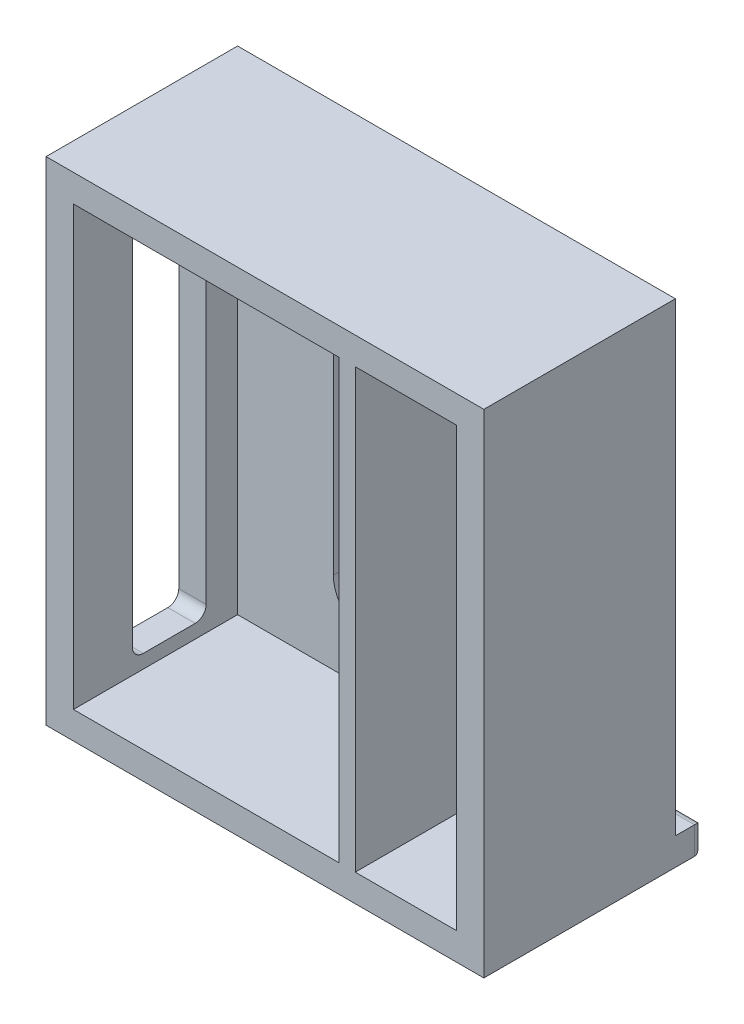
ISO-10303-21;
HEADER;
FILE_DESCRIPTION(('STEP AP214'),'2;1');
FILE_NAME('part.step','',(''),(''),'','','');
FILE_SCHEMA(('AUTOMOTIVE_DESIGN { 1 0 10303 214 1 1 1 1 }'));
ENDSEC;
DATA;
#1=APPLICATION_CONTEXT('core data for automotive mechanical design processes');
#2=APPLICATION_PROTOCOL_DEFINITION('international standard','automotive_design',2000,#1);
#3=PRODUCT_CONTEXT('',#1,'mechanical');
#4=PRODUCT('Part','Part','',(#3));
#5=PRODUCT_RELATED_PRODUCT_CATEGORY('part','',(#4));
#6=PRODUCT_DEFINITION_FORMATION('','',#4);
#7=PRODUCT_DEFINITION_CONTEXT('part definition',#1,'design');
#8=PRODUCT_DEFINITION('design','',#6,#7);
#9=PRODUCT_DEFINITION_SHAPE('','',#8);
#10=(LENGTH_UNIT() NAMED_UNIT(*) SI_UNIT(.MILLI.,.METRE.));
#11=(NAMED_UNIT(*) PLANE_ANGLE_UNIT() SI_UNIT($,.RADIAN.));
#12=(NAMED_UNIT(*) SI_UNIT($,.STERADIAN.) SOLID_ANGLE_UNIT());
#13=UNCERTAINTY_MEASURE_WITH_UNIT(LENGTH_MEASURE(1.E-05),#10,'distance_accuracy_value','');
#14=(GEOMETRIC_REPRESENTATION_CONTEXT(3) GLOBAL_UNCERTAINTY_ASSIGNED_CONTEXT((#13)) GLOBAL_UNIT_ASSIGNED_CONTEXT((#10,
#11,#12)) REPRESENTATION_CONTEXT('',''));
#15=CARTESIAN_POINT('',(0.,0.,0.));
#16=DIRECTION('',(0.,0.,1.));
#17=DIRECTION('',(1.,0.,0.));
#18=AXIS2_PLACEMENT_3D('',#15,#16,#17);
#19=CARTESIAN_POINT('',(-80.,180.,-35.));
#20=DIRECTION('',(0.,0.,1.));
#21=DIRECTION('',(1.,0.,0.));
#22=AXIS2_PLACEMENT_3D('',#19,#20,#21);
#23=PLANE('',#22);
#24=DIRECTION('',(0.,1.,0.));
#25=VECTOR('',#24,1.);
#26=CARTESIAN_POINT('',(-8.00000000000008,180.,-35.));
#27=LINE('',#26,#25);
#28=CARTESIAN_POINT('',(-8.00000000000007,40.,-35.));
#29=VERTEX_POINT('',#28);
#30=CARTESIAN_POINT('',(-8.00000000000007,140.,-35.));
#31=VERTEX_POINT('',#30);
#32=EDGE_CURVE('E466',#29,#31,#27,.T.);
#33=ORIENTED_EDGE('',*,*,#32,.T.);
#34=CARTESIAN_POINT('',(-21.5000000000001,140.,-35.));
#35=DIRECTION('',(0.,0.,1.));
#36=DIRECTION('',(1.,0.,0.));
#37=AXIS2_PLACEMENT_3D('',#34,#35,#36);
#38=CIRCLE('',#37,13.5);
#39=CARTESIAN_POINT('',(-35.0000000000001,140.,-35.));
#40=VERTEX_POINT('',#39);
#41=EDGE_CURVE('E469',#31,#40,#38,.T.);
#42=ORIENTED_EDGE('',*,*,#41,.T.);
#43=DIRECTION('',(0.,-1.,0.));
#44=VECTOR('',#43,1.);
#45=CARTESIAN_POINT('',(-35.0000000000001,180.,-35.));
#46=LINE('',#45,#44);
#47=CARTESIAN_POINT('',(-35.0000000000001,40.,-35.));
#48=VERTEX_POINT('',#47);
#49=EDGE_CURVE('E460',#40,#48,#46,.T.);
#50=ORIENTED_EDGE('',*,*,#49,.T.);
#51=CARTESIAN_POINT('',(-21.5000000000001,40.,-35.));
#52=DIRECTION('',(0.,0.,1.));
#53=DIRECTION('',(1.,0.,0.));
#54=AXIS2_PLACEMENT_3D('',#51,#52,#53);
#55=CIRCLE('',#54,13.5);
#56=EDGE_CURVE('E463',#48,#29,#55,.T.);
#57=ORIENTED_EDGE('',*,*,#56,.T.);
#58=EDGE_LOOP('',(#33,#42,#50,#57));
#59=FACE_BOUND('',#58,.T.);
#60=DIRECTION('',(0.,1.,0.));
#61=VECTOR('',#60,1.);
#62=CARTESIAN_POINT('',(58.9999999999999,180.,-35.));
#63=LINE('',#62,#61);
#64=CARTESIAN_POINT('',(58.9999999999999,42.5,-35.));
#65=VERTEX_POINT('',#64);
#66=CARTESIAN_POINT('',(58.9999999999999,137.5,-35.));
#67=VERTEX_POINT('',#66);
#68=EDGE_CURVE('E478',#65,#67,#63,.T.);
#69=ORIENTED_EDGE('',*,*,#68,.T.);
#70=CARTESIAN_POINT('',(51.4999999999999,137.5,-35.));
#71=DIRECTION('',(0.,0.,1.));
#72=DIRECTION('',(1.,0.,0.));
#73=AXIS2_PLACEMENT_3D('',#70,#71,#72);
#74=CIRCLE('',#73,7.5);
#75=CARTESIAN_POINT('',(43.9999999999999,137.5,-35.));
#76=VERTEX_POINT('',#75);
#77=EDGE_CURVE('E481',#67,#76,#74,.T.);
#78=ORIENTED_EDGE('',*,*,#77,.T.);
#79=DIRECTION('',(0.,-1.,0.));
#80=VECTOR('',#79,1.);
#81=CARTESIAN_POINT('',(43.9999999999999,180.,-35.));
#82=LINE('',#81,#80);
#83=CARTESIAN_POINT('',(44.,42.5,-35.));
#84=VERTEX_POINT('',#83);
#85=EDGE_CURVE('E472',#76,#84,#82,.T.);
#86=ORIENTED_EDGE('',*,*,#85,.T.);
#87=CARTESIAN_POINT('',(51.4999999999999,42.5,-35.));
#88=DIRECTION('',(0.,0.,1.));
#89=DIRECTION('',(1.,0.,0.));
#90=AXIS2_PLACEMENT_3D('',#87,#88,#89);
#91=CIRCLE('',#90,7.5);
#92=EDGE_CURVE('E475',#84,#65,#91,.T.);
#93=ORIENTED_EDGE('',*,*,#92,.T.);
#94=EDGE_LOOP('',(#69,#78,#86,#93));
#95=FACE_BOUND('',#94,.T.);
#96=DIRECTION('',(1.,0.,0.));
#97=VECTOR('',#96,1.);
#98=CARTESIAN_POINT('',(79.9999999999999,10.,-35.));
#99=LINE('',#98,#97);
#100=CARTESIAN_POINT('',(-80.,10.0000000000001,-35.));
#101=VERTEX_POINT('',#100);
#102=CARTESIAN_POINT('',(79.9999999999999,10.,-35.));
#103=VERTEX_POINT('',#102);
#104=EDGE_CURVE('E261',#101,#103,#99,.T.);
#105=ORIENTED_EDGE('',*,*,#104,.F.);
#106=DIRECTION('',(0.,-1.,0.));
#107=VECTOR('',#106,1.);
#108=CARTESIAN_POINT('',(-80.,180.,-35.));
#109=LINE('',#108,#107);
#110=CARTESIAN_POINT('',(-80.,180.,-35.));
#111=VERTEX_POINT('',#110);
#112=EDGE_CURVE('E270',#111,#101,#109,.T.);
#113=ORIENTED_EDGE('',*,*,#112,.F.);
#114=DIRECTION('',(-1.,0.,0.));
#115=VECTOR('',#114,1.);
#116=CARTESIAN_POINT('',(-80.,180.,-35.));
#117=LINE('',#116,#115);
#118=CARTESIAN_POINT('',(80.,180.,-35.));
#119=VERTEX_POINT('',#118);
#120=EDGE_CURVE('E267',#119,#111,#117,.T.);
#121=ORIENTED_EDGE('',*,*,#120,.F.);
#122=DIRECTION('',(0.,-1.,0.));
#123=VECTOR('',#122,1.);
#124=CARTESIAN_POINT('',(80.,180.,-35.));
#125=LINE('',#124,#123);
#126=EDGE_CURVE('E254',#119,#103,#125,.T.);
#127=ORIENTED_EDGE('',*,*,#126,.T.);
#128=EDGE_LOOP('',(#105,#113,#121,#127));
#129=FACE_BOUND('',#128,.T.);
#130=ADVANCED_FACE('F39',(#59,#95,#129),#23,.F.);
#131=CARTESIAN_POINT('',(-80.,180.,-25.));
#132=DIRECTION('',(0.,0.,1.));
#133=DIRECTION('',(1.,0.,0.));
#134=AXIS2_PLACEMENT_3D('',#131,#132,#133);
#135=PLANE('',#134);
#136=CARTESIAN_POINT('',(51.4999999999999,137.5,-25.));
#137=DIRECTION('',(0.,0.,1.));
#138=DIRECTION('',(1.,0.,0.));
#139=AXIS2_PLACEMENT_3D('',#136,#137,#138);
#140=CIRCLE('',#139,7.5);
#141=CARTESIAN_POINT('',(58.9999999999999,137.5,-25.));
#142=VERTEX_POINT('',#141);
#143=CARTESIAN_POINT('',(43.9999999999999,137.5,-25.));
#144=VERTEX_POINT('',#143);
#145=EDGE_CURVE('E342',#142,#144,#140,.T.);
#146=ORIENTED_EDGE('',*,*,#145,.F.);
#147=DIRECTION('',(0.,1.,0.));
#148=VECTOR('',#147,1.);
#149=CARTESIAN_POINT('',(58.9999999999999,137.5,-25.));
#150=LINE('',#149,#148);
#151=CARTESIAN_POINT('',(58.9999999999999,42.5,-25.));
#152=VERTEX_POINT('',#151);
#153=EDGE_CURVE('E350',#152,#142,#150,.T.);
#154=ORIENTED_EDGE('',*,*,#153,.F.);
#155=CARTESIAN_POINT('',(51.4999999999999,42.5,-25.));
#156=DIRECTION('',(0.,0.,1.));
#157=DIRECTION('',(1.,0.,0.));
#158=AXIS2_PLACEMENT_3D('',#155,#156,#157);
#159=CIRCLE('',#158,7.5);
#160=CARTESIAN_POINT('',(43.9999999999999,42.5,-25.));
#161=VERTEX_POINT('',#160);
#162=EDGE_CURVE('E348',#161,#152,#159,.T.);
#163=ORIENTED_EDGE('',*,*,#162,.F.);
#164=DIRECTION('',(0.,-1.,0.));
#165=VECTOR('',#164,1.);
#166=CARTESIAN_POINT('',(43.9999999999999,137.5,-25.));
#167=LINE('',#166,#165);
#168=EDGE_CURVE('E345',#144,#161,#167,.T.);
#169=ORIENTED_EDGE('',*,*,#168,.F.);
#170=EDGE_LOOP('',(#146,#154,#163,#169));
#171=FACE_BOUND('',#170,.T.);
#172=DIRECTION('',(-1.,0.,0.));
#173=VECTOR('',#172,1.);
#174=CARTESIAN_POINT('',(-80.,170.,-25.));
#175=LINE('',#174,#173);
#176=CARTESIAN_POINT('',(70.,170.,-25.));
#177=VERTEX_POINT('',#176);
#178=CARTESIAN_POINT('',(33.,170.,-25.));
#179=VERTEX_POINT('',#178);
#180=EDGE_CURVE('E418',#177,#179,#175,.T.);
#181=ORIENTED_EDGE('',*,*,#180,.T.);
#182=DIRECTION('',(0.,-1.,0.));
#183=VECTOR('',#182,1.);
#184=CARTESIAN_POINT('',(33.,180.,-25.));
#185=LINE('',#184,#183);
#186=CARTESIAN_POINT('',(33.,10.,-25.));
#187=VERTEX_POINT('',#186);
#188=EDGE_CURVE('E392',#179,#187,#185,.T.);
#189=ORIENTED_EDGE('',*,*,#188,.T.);
#190=DIRECTION('',(-1.,0.,0.));
#191=VECTOR('',#190,1.);
#192=CARTESIAN_POINT('',(-80.,10.,-25.));
#193=LINE('',#192,#191);
#194=CARTESIAN_POINT('',(70.,10.,-25.));
#195=VERTEX_POINT('',#194);
#196=EDGE_CURVE('E411',#195,#187,#193,.T.);
#197=ORIENTED_EDGE('',*,*,#196,.F.);
#198=DIRECTION('',(0.,-1.,0.));
#199=VECTOR('',#198,1.);
#200=CARTESIAN_POINT('',(70.,180.,-25.));
#201=LINE('',#200,#199);
#202=EDGE_CURVE('E401',#177,#195,#201,.T.);
#203=ORIENTED_EDGE('',*,*,#202,.F.);
#204=EDGE_LOOP('',(#181,#189,#197,#203));
#205=FACE_BOUND('',#204,.T.);
#206=ADVANCED_FACE('F544',(#171,#205),#135,.T.);
#207=CARTESIAN_POINT('',(0.,170.,0.));
#208=DIRECTION('',(0.,1.,0.));
#209=DIRECTION('',(0.,0.,1.));
#210=AXIS2_PLACEMENT_3D('',#207,#208,#209);
#211=PLANE('',#210);
#212=DIRECTION('',(0.,0.,-1.));
#213=VECTOR('',#212,1.);
#214=CARTESIAN_POINT('',(33.,170.,0.));
#215=LINE('',#214,#213);
#216=CARTESIAN_POINT('',(33.,170.,35.));
#217=VERTEX_POINT('',#216);
#218=EDGE_CURVE('E376',#217,#179,#215,.T.);
#219=ORIENTED_EDGE('',*,*,#218,.T.);
#220=ORIENTED_EDGE('',*,*,#180,.F.);
#221=DIRECTION('',(0.,0.,-1.));
#222=VECTOR('',#221,1.);
#223=CARTESIAN_POINT('',(70.,170.,-35.));
#224=LINE('',#223,#222);
#225=CARTESIAN_POINT('',(70.,170.,35.));
#226=VERTEX_POINT('',#225);
#227=EDGE_CURVE('E406',#226,#177,#224,.T.);
#228=ORIENTED_EDGE('',*,*,#227,.F.);
#229=DIRECTION('',(1.,0.,0.));
#230=VECTOR('',#229,1.);
#231=CARTESIAN_POINT('',(-80.,170.,35.));
#232=LINE('',#231,#230);
#233=EDGE_CURVE('E426',#217,#226,#232,.T.);
#234=ORIENTED_EDGE('',*,*,#233,.F.);
#235=EDGE_LOOP('',(#219,#220,#228,#234));
#236=FACE_BOUND('',#235,.T.);
#237=ADVANCED_FACE('F536',(#236),#211,.F.);
#238=CARTESIAN_POINT('',(0.,10.,0.));
#239=DIRECTION('',(0.,1.,0.));
#240=DIRECTION('',(0.,0.,1.));
#241=AXIS2_PLACEMENT_3D('',#238,#239,#240);
#242=PLANE('',#241);
#243=ORIENTED_EDGE('',*,*,#196,.T.);
#244=DIRECTION('',(0.,0.,1.));
#245=VECTOR('',#244,1.);
#246=CARTESIAN_POINT('',(33.,10.,0.));
#247=LINE('',#246,#245);
#248=CARTESIAN_POINT('',(33.,10.,35.));
#249=VERTEX_POINT('',#248);
#250=EDGE_CURVE('E269',#187,#249,#247,.T.);
#251=ORIENTED_EDGE('',*,*,#250,.T.);
#252=DIRECTION('',(1.,0.,0.));
#253=VECTOR('',#252,1.);
#254=CARTESIAN_POINT('',(-80.,10.,35.));
#255=LINE('',#254,#253);
#256=CARTESIAN_POINT('',(70.,10.,35.));
#257=VERTEX_POINT('',#256);
#258=EDGE_CURVE('E423',#249,#257,#255,.T.);
#259=ORIENTED_EDGE('',*,*,#258,.T.);
#260=DIRECTION('',(0.,0.,-1.));
#261=VECTOR('',#260,1.);
#262=CARTESIAN_POINT('',(70.,10.,-35.));
#263=LINE('',#262,#261);
#264=EDGE_CURVE('E397',#257,#195,#263,.T.);
#265=ORIENTED_EDGE('',*,*,#264,.T.);
#266=EDGE_LOOP('',(#243,#251,#259,#265));
#267=FACE_BOUND('',#266,.T.);
#268=ADVANCED_FACE('F528',(#267),#242,.T.);
#269=CARTESIAN_POINT('',(-80.,180.,35.));
#270=DIRECTION('',(0.,0.,-1.));
#271=DIRECTION('',(-1.,0.,0.));
#272=AXIS2_PLACEMENT_3D('',#269,#270,#271);
#273=PLANE('',#272);
#274=DIRECTION('',(0.,-1.,0.));
#275=VECTOR('',#274,1.);
#276=CARTESIAN_POINT('',(27.,240.256672281001,35.));
#277=LINE('',#276,#275);
#278=CARTESIAN_POINT('',(27.,170.,35.));
#279=VERTEX_POINT('',#278);
#280=CARTESIAN_POINT('',(27.,10.0000000000001,35.));
#281=VERTEX_POINT('',#280);
#282=EDGE_CURVE('E385',#279,#281,#277,.T.);
#283=ORIENTED_EDGE('',*,*,#282,.T.);
#284=CARTESIAN_POINT('',(-70.,10.,35.));
#285=VERTEX_POINT('',#284);
#286=EDGE_CURVE('E410',#285,#281,#255,.T.);
#287=ORIENTED_EDGE('',*,*,#286,.F.);
#288=DIRECTION('',(0.,-1.,0.));
#289=VECTOR('',#288,1.);
#290=CARTESIAN_POINT('',(-70.,180.,35.));
#291=LINE('',#290,#289);
#292=CARTESIAN_POINT('',(-70.,170.,35.));
#293=VERTEX_POINT('',#292);
#294=EDGE_CURVE('E417',#293,#285,#291,.T.);
#295=ORIENTED_EDGE('',*,*,#294,.F.);
#296=EDGE_CURVE('E430',#293,#279,#232,.T.);
#297=ORIENTED_EDGE('',*,*,#296,.T.);
#298=EDGE_LOOP('',(#283,#287,#295,#297));
#299=FACE_BOUND('',#298,.T.);
#300=ORIENTED_EDGE('',*,*,#258,.F.);
#301=DIRECTION('',(0.,-1.,0.));
#302=VECTOR('',#301,1.);
#303=CARTESIAN_POINT('',(33.,240.256672281001,35.));
#304=LINE('',#303,#302);
#305=EDGE_CURVE('E388',#217,#249,#304,.T.);
#306=ORIENTED_EDGE('',*,*,#305,.F.);
#307=ORIENTED_EDGE('',*,*,#233,.T.);
#308=DIRECTION('',(0.,-1.,0.));
#309=VECTOR('',#308,1.);
#310=CARTESIAN_POINT('',(70.,180.,35.));
#311=LINE('',#310,#309);
#312=EDGE_CURVE('E427',#226,#257,#311,.T.);
#313=ORIENTED_EDGE('',*,*,#312,.T.);
#314=EDGE_LOOP('',(#300,#306,#307,#313));
#315=FACE_BOUND('',#314,.T.);
#316=DIRECTION('',(1.,0.,0.));
#317=VECTOR('',#316,1.);
#318=CARTESIAN_POINT('',(-80.,0.,35.));
#319=LINE('',#318,#317);
#320=CARTESIAN_POINT('',(-80.,0.,35.));
#321=VERTEX_POINT('',#320);
#322=CARTESIAN_POINT('',(80.,0.,35.));
#323=VERTEX_POINT('',#322);
#324=EDGE_CURVE('E439',#321,#323,#319,.T.);
#325=ORIENTED_EDGE('',*,*,#324,.T.);
#326=DIRECTION('',(0.,-1.,0.));
#327=VECTOR('',#326,1.);
#328=CARTESIAN_POINT('',(80.,180.,35.));
#329=LINE('',#328,#327);
#330=CARTESIAN_POINT('',(80.,180.,35.));
#331=VERTEX_POINT('',#330);
#332=EDGE_CURVE('E445',#331,#323,#329,.T.);
#333=ORIENTED_EDGE('',*,*,#332,.F.);
#334=DIRECTION('',(1.,0.,0.));
#335=VECTOR('',#334,1.);
#336=CARTESIAN_POINT('',(-80.,180.,35.));
#337=LINE('',#336,#335);
#338=CARTESIAN_POINT('',(-80.,180.,35.));
#339=VERTEX_POINT('',#338);
#340=EDGE_CURVE('E443',#339,#331,#337,.T.);
#341=ORIENTED_EDGE('',*,*,#340,.F.);
#342=DIRECTION('',(0.,-1.,0.));
#343=VECTOR('',#342,1.);
#344=CARTESIAN_POINT('',(-80.,180.,35.));
#345=LINE('',#344,#343);
#346=EDGE_CURVE('E452',#339,#321,#345,.T.);
#347=ORIENTED_EDGE('',*,*,#346,.T.);
#348=EDGE_LOOP('',(#325,#333,#341,#347));
#349=FACE_BOUND('',#348,.T.);
#350=ADVANCED_FACE('F526',(#299,#315,#349),#273,.F.);
#351=CARTESIAN_POINT('',(80.,180.,-35.));
#352=DIRECTION('',(-1.,0.,0.));
#353=DIRECTION('',(0.,0.,1.));
#354=AXIS2_PLACEMENT_3D('',#351,#352,#353);
#355=PLANE('',#354);
#356=DIRECTION('',(0.,0.,-1.));
#357=VECTOR('',#356,1.);
#358=CARTESIAN_POINT('',(80.,0.,-35.));
#359=LINE('',#358,#357);
#360=CARTESIAN_POINT('',(80.,0.,-42.));
#361=VERTEX_POINT('',#360);
#362=EDGE_CURVE('E404',#323,#361,#359,.T.);
#363=ORIENTED_EDGE('',*,*,#362,.T.);
#364=DIRECTION('',(0.,-1.,0.));
#365=VECTOR('',#364,1.);
#366=CARTESIAN_POINT('',(80.,180.,-42.));
#367=LINE('',#366,#365);
#368=CARTESIAN_POINT('',(79.9999999999999,10.,-42.));
#369=VERTEX_POINT('',#368);
#370=EDGE_CURVE('E11',#361,#369,#367,.F.);
#371=ORIENTED_EDGE('',*,*,#370,.T.);
#372=DIRECTION('',(0.,0.,1.));
#373=VECTOR('',#372,1.);
#374=CARTESIAN_POINT('',(79.9999999999999,10.,-45.));
#375=LINE('',#374,#373);
#376=EDGE_CURVE('E250',#369,#103,#375,.T.);
#377=ORIENTED_EDGE('',*,*,#376,.T.);
#378=ORIENTED_EDGE('',*,*,#126,.F.);
#379=DIRECTION('',(0.,0.,-1.));
#380=VECTOR('',#379,1.);
#381=CARTESIAN_POINT('',(80.,180.,-35.));
#382=LINE('',#381,#380);
#383=EDGE_CURVE('E437',#331,#119,#382,.T.);
#384=ORIENTED_EDGE('',*,*,#383,.F.);
#385=ORIENTED_EDGE('',*,*,#332,.T.);
#386=EDGE_LOOP('',(#363,#371,#377,#378,#384,#385));
#387=FACE_BOUND('',#386,.T.);
#388=ADVANCED_FACE('F252',(#387),#355,.F.);
#389=CARTESIAN_POINT('',(-80.,180.,-35.));
#390=DIRECTION('',(1.,0.,0.));
#391=DIRECTION('',(0.,0.,-1.));
#392=AXIS2_PLACEMENT_3D('',#389,#390,#391);
#393=PLANE('',#392);
#394=CARTESIAN_POINT('',(-80.,161.,-9.50000000000002));
#395=DIRECTION('',(-1.,0.,0.));
#396=DIRECTION('',(0.,0.,1.));
#397=AXIS2_PLACEMENT_3D('',#394,#395,#396);
#398=CIRCLE('',#397,4.);
#399=CARTESIAN_POINT('',(-80.,165.,-9.49999999999999));
#400=VERTEX_POINT('',#399);
#401=CARTESIAN_POINT('',(-80.,161.,-13.5));
#402=VERTEX_POINT('',#401);
#403=EDGE_CURVE('E305',#400,#402,#398,.T.);
#404=ORIENTED_EDGE('',*,*,#403,.F.);
#405=DIRECTION('',(0.,0.,-1.));
#406=VECTOR('',#405,1.);
#407=CARTESIAN_POINT('',(-80.,165.,-9.49999999999999));
#408=LINE('',#407,#406);
#409=CARTESIAN_POINT('',(-80.,165.,9.49999999999995));
#410=VERTEX_POINT('',#409);
#411=EDGE_CURVE('E302',#410,#400,#408,.T.);
#412=ORIENTED_EDGE('',*,*,#411,.F.);
#413=CARTESIAN_POINT('',(-80.,161.,9.49999999999998));
#414=DIRECTION('',(-1.,0.,0.));
#415=DIRECTION('',(0.,0.,-1.));
#416=AXIS2_PLACEMENT_3D('',#413,#414,#415);
#417=CIRCLE('',#416,4.);
#418=CARTESIAN_POINT('',(-80.,161.,13.5));
#419=VERTEX_POINT('',#418);
#420=EDGE_CURVE('E299',#419,#410,#417,.T.);
#421=ORIENTED_EDGE('',*,*,#420,.F.);
#422=DIRECTION('',(0.,1.,0.));
#423=VECTOR('',#422,1.);
#424=CARTESIAN_POINT('',(-80.,161.,13.5));
#425=LINE('',#424,#423);
#426=CARTESIAN_POINT('',(-80.,19.,13.5));
#427=VERTEX_POINT('',#426);
#428=EDGE_CURVE('E320',#427,#419,#425,.T.);
#429=ORIENTED_EDGE('',*,*,#428,.F.);
#430=CARTESIAN_POINT('',(-80.,19.,9.50000000000002));
#431=DIRECTION('',(-1.,0.,0.));
#432=DIRECTION('',(0.,0.,1.));
#433=AXIS2_PLACEMENT_3D('',#430,#431,#432);
#434=CIRCLE('',#433,4.);
#435=CARTESIAN_POINT('',(-80.,15.,9.49999999999999));
#436=VERTEX_POINT('',#435);
#437=EDGE_CURVE('E317',#436,#427,#434,.T.);
#438=ORIENTED_EDGE('',*,*,#437,.F.);
#439=DIRECTION('',(0.,0.,1.));
#440=VECTOR('',#439,1.);
#441=CARTESIAN_POINT('',(-80.,15.,-9.49999999999999));
#442=LINE('',#441,#440);
#443=CARTESIAN_POINT('',(-80.,15.,-9.49999999999999));
#444=VERTEX_POINT('',#443);
#445=EDGE_CURVE('E314',#444,#436,#442,.T.);
#446=ORIENTED_EDGE('',*,*,#445,.F.);
#447=CARTESIAN_POINT('',(-80.,19.,-9.50000000000002));
#448=DIRECTION('',(-1.,0.,0.));
#449=DIRECTION('',(0.,0.,1.));
#450=AXIS2_PLACEMENT_3D('',#447,#448,#449);
#451=CIRCLE('',#450,4.);
#452=CARTESIAN_POINT('',(-80.,19.,-13.5));
#453=VERTEX_POINT('',#452);
#454=EDGE_CURVE('E311',#453,#444,#451,.T.);
#455=ORIENTED_EDGE('',*,*,#454,.F.);
#456=DIRECTION('',(0.,-1.,0.));
#457=VECTOR('',#456,1.);
#458=CARTESIAN_POINT('',(-80.,161.,-13.5));
#459=LINE('',#458,#457);
#460=EDGE_CURVE('E308',#402,#453,#459,.T.);
#461=ORIENTED_EDGE('',*,*,#460,.F.);
#462=EDGE_LOOP('',(#404,#412,#421,#429,#438,#446,#455,#461));
#463=FACE_BOUND('',#462,.T.);
#464=DIRECTION('',(0.,0.,1.));
#465=VECTOR('',#464,1.);
#466=CARTESIAN_POINT('',(-80.0000000000001,10.,-45.));
#467=LINE('',#466,#465);
#468=CARTESIAN_POINT('',(-80.0000000000001,10.,-42.));
#469=VERTEX_POINT('',#468);
#470=EDGE_CURVE('E260',#469,#101,#467,.T.);
#471=ORIENTED_EDGE('',*,*,#470,.F.);
#472=DIRECTION('',(0.,1.,0.));
#473=VECTOR('',#472,1.);
#474=CARTESIAN_POINT('',(-80.,180.,-42.));
#475=LINE('',#474,#473);
#476=CARTESIAN_POINT('',(-80.,0.,-42.));
#477=VERTEX_POINT('',#476);
#478=EDGE_CURVE('E63',#469,#477,#475,.F.);
#479=ORIENTED_EDGE('',*,*,#478,.T.);
#480=DIRECTION('',(0.,0.,1.));
#481=VECTOR('',#480,1.);
#482=CARTESIAN_POINT('',(-80.,0.,-35.));
#483=LINE('',#482,#481);
#484=EDGE_CURVE('E447',#477,#321,#483,.T.);
#485=ORIENTED_EDGE('',*,*,#484,.T.);
#486=ORIENTED_EDGE('',*,*,#346,.F.);
#487=DIRECTION('',(0.,0.,1.));
#488=VECTOR('',#487,1.);
#489=CARTESIAN_POINT('',(-80.,180.,-35.));
#490=LINE('',#489,#488);
#491=EDGE_CURVE('E441',#111,#339,#490,.T.);
#492=ORIENTED_EDGE('',*,*,#491,.F.);
#493=ORIENTED_EDGE('',*,*,#112,.T.);
#494=EDGE_LOOP('',(#471,#479,#485,#486,#492,#493));
#495=FACE_BOUND('',#494,.T.);
#496=ADVANCED_FACE('F516',(#463,#495),#393,.F.);
#497=CARTESIAN_POINT('',(0.,180.,0.));
#498=DIRECTION('',(0.,1.,0.));
#499=DIRECTION('',(0.,0.,1.));
#500=AXIS2_PLACEMENT_3D('',#497,#498,#499);
#501=PLANE('',#500);
#502=ORIENTED_EDGE('',*,*,#383,.T.);
#503=ORIENTED_EDGE('',*,*,#120,.T.);
#504=ORIENTED_EDGE('',*,*,#491,.T.);
#505=ORIENTED_EDGE('',*,*,#340,.T.);
#506=EDGE_LOOP('',(#502,#503,#504,#505));
#507=FACE_BOUND('',#506,.T.);
#508=ADVANCED_FACE('F521',(#507),#501,.T.);
#509=CARTESIAN_POINT('',(0.,0.,0.));
#510=DIRECTION('',(0.,1.,0.));
#511=DIRECTION('',(0.,0.,1.));
#512=AXIS2_PLACEMENT_3D('',#509,#510,#511);
#513=PLANE('',#512);
#514=ORIENTED_EDGE('',*,*,#484,.F.);
#515=DIRECTION('',(-1.,0.,0.));
#516=VECTOR('',#515,1.);
#517=CARTESIAN_POINT('',(0.,0.,-42.));
#518=LINE('',#517,#516);
#519=EDGE_CURVE('E48',#477,#361,#518,.F.);
#520=ORIENTED_EDGE('',*,*,#519,.T.);
#521=ORIENTED_EDGE('',*,*,#362,.F.);
#522=ORIENTED_EDGE('',*,*,#324,.F.);
#523=EDGE_LOOP('',(#514,#520,#521,#522));
#524=FACE_BOUND('',#523,.T.);
#525=ADVANCED_FACE('F525',(#524),#513,.F.);
#526=CARTESIAN_POINT('',(70.,180.,-35.));
#527=DIRECTION('',(-1.,0.,0.));
#528=DIRECTION('',(0.,0.,1.));
#529=AXIS2_PLACEMENT_3D('',#526,#527,#528);
#530=PLANE('',#529);
#531=ORIENTED_EDGE('',*,*,#264,.F.);
#532=ORIENTED_EDGE('',*,*,#312,.F.);
#533=ORIENTED_EDGE('',*,*,#227,.T.);
#534=ORIENTED_EDGE('',*,*,#202,.T.);
#535=EDGE_LOOP('',(#531,#532,#533,#534));
#536=FACE_BOUND('',#535,.T.);
#537=ADVANCED_FACE('F645',(#536),#530,.T.);
#538=CARTESIAN_POINT('',(-21.5000000000001,140.,-25.));
#539=DIRECTION('',(0.,0.,1.));
#540=DIRECTION('',(1.,0.,0.));
#541=AXIS2_PLACEMENT_3D('',#538,#539,#540);
#542=CIRCLE('',#541,13.5);
#543=CARTESIAN_POINT('',(-8.00000000000007,140.,-25.));
#544=VERTEX_POINT('',#543);
#545=CARTESIAN_POINT('',(-35.0000000000001,140.,-25.));
#546=VERTEX_POINT('',#545);
#547=EDGE_CURVE('E356',#544,#546,#542,.T.);
#548=ORIENTED_EDGE('',*,*,#547,.F.);
#549=DIRECTION('',(0.,1.,0.));
#550=VECTOR('',#549,1.);
#551=CARTESIAN_POINT('',(-8.00000000000007,140.,-25.));
#552=LINE('',#551,#550);
#553=CARTESIAN_POINT('',(-8.00000000000007,40.,-25.));
#554=VERTEX_POINT('',#553);
#555=EDGE_CURVE('E370',#554,#544,#552,.T.);
#556=ORIENTED_EDGE('',*,*,#555,.F.);
#557=CARTESIAN_POINT('',(-21.5000000000001,40.,-25.));
#558=DIRECTION('',(0.,0.,1.));
#559=DIRECTION('',(1.,0.,0.));
#560=AXIS2_PLACEMENT_3D('',#557,#558,#559);
#561=CIRCLE('',#560,13.5);
#562=CARTESIAN_POINT('',(-35.0000000000001,40.,-25.));
#563=VERTEX_POINT('',#562);
#564=EDGE_CURVE('E368',#563,#554,#561,.T.);
#565=ORIENTED_EDGE('',*,*,#564,.F.);
#566=DIRECTION('',(0.,-1.,0.));
#567=VECTOR('',#566,1.);
#568=CARTESIAN_POINT('',(-35.0000000000001,140.,-25.));
#569=LINE('',#568,#567);
#570=EDGE_CURVE('E365',#546,#563,#569,.T.);
#571=ORIENTED_EDGE('',*,*,#570,.F.);
#572=EDGE_LOOP('',(#548,#556,#565,#571));
#573=FACE_BOUND('',#572,.T.);
#574=DIRECTION('',(0.,-1.,0.));
#575=VECTOR('',#574,1.);
#576=CARTESIAN_POINT('',(27.,180.,-25.));
#577=LINE('',#576,#575);
#578=CARTESIAN_POINT('',(27.,170.,-25.));
#579=VERTEX_POINT('',#578);
#580=CARTESIAN_POINT('',(27.,10.,-25.));
#581=VERTEX_POINT('',#580);
#582=EDGE_CURVE('E395',#579,#581,#577,.T.);
#583=ORIENTED_EDGE('',*,*,#582,.F.);
#584=CARTESIAN_POINT('',(-70.,170.,-25.));
#585=VERTEX_POINT('',#584);
#586=EDGE_CURVE('E409',#579,#585,#175,.T.);
#587=ORIENTED_EDGE('',*,*,#586,.T.);
#588=DIRECTION('',(0.,-1.,0.));
#589=VECTOR('',#588,1.);
#590=CARTESIAN_POINT('',(-70.,180.,-25.));
#591=LINE('',#590,#589);
#592=CARTESIAN_POINT('',(-70.,10.,-25.));
#593=VERTEX_POINT('',#592);
#594=EDGE_CURVE('E405',#585,#593,#591,.T.);
#595=ORIENTED_EDGE('',*,*,#594,.T.);
#596=EDGE_CURVE('E400',#581,#593,#193,.T.);
#597=ORIENTED_EDGE('',*,*,#596,.F.);
#598=EDGE_LOOP('',(#583,#587,#595,#597));
#599=FACE_BOUND('',#598,.T.);
#600=ADVANCED_FACE('F552',(#573,#599),#135,.T.);
#601=CARTESIAN_POINT('',(-70.,180.,-35.));
#602=DIRECTION('',(1.,0.,0.));
#603=DIRECTION('',(0.,0.,-1.));
#604=AXIS2_PLACEMENT_3D('',#601,#602,#603);
#605=PLANE('',#604);
#606=DIRECTION('',(0.,0.,-1.));
#607=VECTOR('',#606,1.);
#608=CARTESIAN_POINT('',(-70.,165.,-9.49999999999999));
#609=LINE('',#608,#607);
#610=CARTESIAN_POINT('',(-70.,165.,9.49999999999995));
#611=VERTEX_POINT('',#610);
#612=CARTESIAN_POINT('',(-70.,165.,-9.49999999999999));
#613=VERTEX_POINT('',#612);
#614=EDGE_CURVE('E326',#611,#613,#609,.T.);
#615=ORIENTED_EDGE('',*,*,#614,.T.);
#616=CARTESIAN_POINT('',(-70.,161.,-9.50000000000002));
#617=DIRECTION('',(1.,0.,0.));
#618=DIRECTION('',(0.,0.,-1.));
#619=AXIS2_PLACEMENT_3D('',#616,#617,#618);
#620=CIRCLE('',#619,4.);
#621=CARTESIAN_POINT('',(-70.,161.,-13.5));
#622=VERTEX_POINT('',#621);
#623=EDGE_CURVE('E278',#613,#622,#620,.F.);
#624=ORIENTED_EDGE('',*,*,#623,.T.);
#625=DIRECTION('',(0.,-1.,0.));
#626=VECTOR('',#625,1.);
#627=CARTESIAN_POINT('',(-70.,161.,-13.5));
#628=LINE('',#627,#626);
#629=CARTESIAN_POINT('',(-70.,19.,-13.5));
#630=VERTEX_POINT('',#629);
#631=EDGE_CURVE('E281',#622,#630,#628,.T.);
#632=ORIENTED_EDGE('',*,*,#631,.T.);
#633=CARTESIAN_POINT('',(-70.,19.,-9.50000000000002));
#634=DIRECTION('',(1.,0.,0.));
#635=DIRECTION('',(0.,0.,-1.));
#636=AXIS2_PLACEMENT_3D('',#633,#634,#635);
#637=CIRCLE('',#636,4.);
#638=CARTESIAN_POINT('',(-70.,15.,-9.49999999999999));
#639=VERTEX_POINT('',#638);
#640=EDGE_CURVE('E284',#630,#639,#637,.F.);
#641=ORIENTED_EDGE('',*,*,#640,.T.);
#642=DIRECTION('',(0.,0.,1.));
#643=VECTOR('',#642,1.);
#644=CARTESIAN_POINT('',(-70.,15.,-9.49999999999999));
#645=LINE('',#644,#643);
#646=CARTESIAN_POINT('',(-70.,15.,9.49999999999999));
#647=VERTEX_POINT('',#646);
#648=EDGE_CURVE('E287',#639,#647,#645,.T.);
#649=ORIENTED_EDGE('',*,*,#648,.T.);
#650=CARTESIAN_POINT('',(-70.,19.,9.50000000000002));
#651=DIRECTION('',(1.,0.,0.));
#652=DIRECTION('',(0.,0.,-1.));
#653=AXIS2_PLACEMENT_3D('',#650,#651,#652);
#654=CIRCLE('',#653,4.);
#655=CARTESIAN_POINT('',(-70.,19.,13.5));
#656=VERTEX_POINT('',#655);
#657=EDGE_CURVE('E290',#647,#656,#654,.F.);
#658=ORIENTED_EDGE('',*,*,#657,.T.);
#659=DIRECTION('',(0.,1.,0.));
#660=VECTOR('',#659,1.);
#661=CARTESIAN_POINT('',(-70.,161.,13.5));
#662=LINE('',#661,#660);
#663=CARTESIAN_POINT('',(-70.,161.,13.5));
#664=VERTEX_POINT('',#663);
#665=EDGE_CURVE('E293',#656,#664,#662,.T.);
#666=ORIENTED_EDGE('',*,*,#665,.T.);
#667=CARTESIAN_POINT('',(-70.,161.,9.49999999999998));
#668=DIRECTION('',(1.,0.,0.));
#669=DIRECTION('',(0.,0.,-1.));
#670=AXIS2_PLACEMENT_3D('',#667,#668,#669);
#671=CIRCLE('',#670,4.);
#672=EDGE_CURVE('E296',#664,#611,#671,.F.);
#673=ORIENTED_EDGE('',*,*,#672,.T.);
#674=EDGE_LOOP('',(#615,#624,#632,#641,#649,#658,#666,#673));
#675=FACE_BOUND('',#674,.T.);
#676=DIRECTION('',(0.,0.,1.));
#677=VECTOR('',#676,1.);
#678=CARTESIAN_POINT('',(-70.,10.,-35.));
#679=LINE('',#678,#677);
#680=EDGE_CURVE('E414',#593,#285,#679,.T.);
#681=ORIENTED_EDGE('',*,*,#680,.F.);
#682=ORIENTED_EDGE('',*,*,#594,.F.);
#683=DIRECTION('',(0.,0.,1.));
#684=VECTOR('',#683,1.);
#685=CARTESIAN_POINT('',(-70.,170.,-35.));
#686=LINE('',#685,#684);
#687=EDGE_CURVE('E421',#585,#293,#686,.T.);
#688=ORIENTED_EDGE('',*,*,#687,.T.);
#689=ORIENTED_EDGE('',*,*,#294,.T.);
#690=EDGE_LOOP('',(#681,#682,#688,#689));
#691=FACE_BOUND('',#690,.T.);
#692=ADVANCED_FACE('F650',(#675,#691),#605,.T.);
#693=ORIENTED_EDGE('',*,*,#586,.F.);
#694=DIRECTION('',(0.,0.,-1.));
#695=VECTOR('',#694,1.);
#696=CARTESIAN_POINT('',(27.,170.,0.));
#697=LINE('',#696,#695);
#698=EDGE_CURVE('E386',#279,#579,#697,.T.);
#699=ORIENTED_EDGE('',*,*,#698,.F.);
#700=ORIENTED_EDGE('',*,*,#296,.F.);
#701=ORIENTED_EDGE('',*,*,#687,.F.);
#702=EDGE_LOOP('',(#693,#699,#700,#701));
#703=FACE_BOUND('',#702,.T.);
#704=ADVANCED_FACE('F654',(#703),#211,.F.);
#705=DIRECTION('',(0.,0.,1.));
#706=VECTOR('',#705,1.);
#707=CARTESIAN_POINT('',(27.,10.,0.));
#708=LINE('',#707,#706);
#709=EDGE_CURVE('E458',#581,#281,#708,.T.);
#710=ORIENTED_EDGE('',*,*,#709,.F.);
#711=ORIENTED_EDGE('',*,*,#596,.T.);
#712=ORIENTED_EDGE('',*,*,#680,.T.);
#713=ORIENTED_EDGE('',*,*,#286,.T.);
#714=EDGE_LOOP('',(#710,#711,#712,#713));
#715=FACE_BOUND('',#714,.T.);
#716=ADVANCED_FACE('F539',(#715),#242,.T.);
#717=CARTESIAN_POINT('',(27.,240.256672281001,0.));
#718=DIRECTION('',(-1.,0.,0.));
#719=DIRECTION('',(0.,0.,1.));
#720=AXIS2_PLACEMENT_3D('',#717,#718,#719);
#721=PLANE('',#720);
#722=ORIENTED_EDGE('',*,*,#698,.T.);
#723=ORIENTED_EDGE('',*,*,#582,.T.);
#724=ORIENTED_EDGE('',*,*,#709,.T.);
#725=ORIENTED_EDGE('',*,*,#282,.F.);
#726=EDGE_LOOP('',(#722,#723,#724,#725));
#727=FACE_BOUND('',#726,.T.);
#728=ADVANCED_FACE('F640',(#727),#721,.T.);
#729=CARTESIAN_POINT('',(33.,240.256672281001,0.));
#730=DIRECTION('',(-1.,0.,0.));
#731=DIRECTION('',(0.,0.,1.));
#732=AXIS2_PLACEMENT_3D('',#729,#730,#731);
#733=PLANE('',#732);
#734=ORIENTED_EDGE('',*,*,#188,.F.);
#735=ORIENTED_EDGE('',*,*,#218,.F.);
#736=ORIENTED_EDGE('',*,*,#305,.T.);
#737=ORIENTED_EDGE('',*,*,#250,.F.);
#738=EDGE_LOOP('',(#734,#735,#736,#737));
#739=FACE_BOUND('',#738,.T.);
#740=ADVANCED_FACE('F636',(#739),#733,.F.);
#741=CARTESIAN_POINT('',(-21.5000000000001,140.,-195.));
#742=DIRECTION('',(0.,0.,1.));
#743=DIRECTION('',(1.,0.,0.));
#744=AXIS2_PLACEMENT_3D('',#741,#742,#743);
#745=CYLINDRICAL_SURFACE('',#744,13.5);
#746=DIRECTION('',(0.,0.,1.));
#747=VECTOR('',#746,1.);
#748=CARTESIAN_POINT('',(-8.00000000000007,140.,-195.));
#749=LINE('',#748,#747);
#750=EDGE_CURVE('E374',#31,#544,#749,.T.);
#751=ORIENTED_EDGE('',*,*,#750,.T.);
#752=ORIENTED_EDGE('',*,*,#547,.T.);
#753=DIRECTION('',(0.,0.,1.));
#754=VECTOR('',#753,1.);
#755=CARTESIAN_POINT('',(-35.0000000000001,140.,-195.));
#756=LINE('',#755,#754);
#757=EDGE_CURVE('E373',#40,#546,#756,.T.);
#758=ORIENTED_EDGE('',*,*,#757,.F.);
#759=ORIENTED_EDGE('',*,*,#41,.F.);
#760=EDGE_LOOP('',(#751,#752,#758,#759));
#761=FACE_BOUND('',#760,.T.);
#762=ADVANCED_FACE('F626',(#761),#745,.F.);
#763=CARTESIAN_POINT('',(-8.00000000000007,140.,-195.));
#764=DIRECTION('',(1.,0.,0.));
#765=DIRECTION('',(0.,0.,-1.));
#766=AXIS2_PLACEMENT_3D('',#763,#764,#765);
#767=PLANE('',#766);
#768=DIRECTION('',(0.,0.,1.));
#769=VECTOR('',#768,1.);
#770=CARTESIAN_POINT('',(-8.00000000000007,40.,-195.));
#771=LINE('',#770,#769);
#772=EDGE_CURVE('E377',#29,#554,#771,.T.);
#773=ORIENTED_EDGE('',*,*,#772,.T.);
#774=ORIENTED_EDGE('',*,*,#555,.T.);
#775=ORIENTED_EDGE('',*,*,#750,.F.);
#776=ORIENTED_EDGE('',*,*,#32,.F.);
#777=EDGE_LOOP('',(#773,#774,#775,#776));
#778=FACE_BOUND('',#777,.T.);
#779=ADVANCED_FACE('F622',(#778),#767,.F.);
#780=CARTESIAN_POINT('',(-21.5000000000001,40.,-195.));
#781=DIRECTION('',(0.,0.,1.));
#782=DIRECTION('',(1.,0.,0.));
#783=AXIS2_PLACEMENT_3D('',#780,#781,#782);
#784=CYLINDRICAL_SURFACE('',#783,13.5);
#785=DIRECTION('',(0.,0.,1.));
#786=VECTOR('',#785,1.);
#787=CARTESIAN_POINT('',(-35.0000000000001,40.,-195.));
#788=LINE('',#787,#786);
#789=EDGE_CURVE('E380',#48,#563,#788,.T.);
#790=ORIENTED_EDGE('',*,*,#789,.T.);
#791=ORIENTED_EDGE('',*,*,#564,.T.);
#792=ORIENTED_EDGE('',*,*,#772,.F.);
#793=ORIENTED_EDGE('',*,*,#56,.F.);
#794=EDGE_LOOP('',(#790,#791,#792,#793));
#795=FACE_BOUND('',#794,.T.);
#796=ADVANCED_FACE('F625',(#795),#784,.F.);
#797=CARTESIAN_POINT('',(-35.0000000000001,140.,-195.));
#798=DIRECTION('',(-1.,0.,0.));
#799=DIRECTION('',(0.,0.,1.));
#800=AXIS2_PLACEMENT_3D('',#797,#798,#799);
#801=PLANE('',#800);
#802=ORIENTED_EDGE('',*,*,#757,.T.);
#803=ORIENTED_EDGE('',*,*,#570,.T.);
#804=ORIENTED_EDGE('',*,*,#789,.F.);
#805=ORIENTED_EDGE('',*,*,#49,.F.);
#806=EDGE_LOOP('',(#802,#803,#804,#805));
#807=FACE_BOUND('',#806,.T.);
#808=ADVANCED_FACE('F620',(#807),#801,.F.);
#809=CARTESIAN_POINT('',(51.4999999999999,137.5,-195.));
#810=DIRECTION('',(0.,0.,1.));
#811=DIRECTION('',(1.,0.,0.));
#812=AXIS2_PLACEMENT_3D('',#809,#810,#811);
#813=CYLINDRICAL_SURFACE('',#812,7.5);
#814=DIRECTION('',(0.,0.,1.));
#815=VECTOR('',#814,1.);
#816=CARTESIAN_POINT('',(58.9999999999999,137.5,-195.));
#817=LINE('',#816,#815);
#818=EDGE_CURVE('E354',#67,#142,#817,.T.);
#819=ORIENTED_EDGE('',*,*,#818,.T.);
#820=ORIENTED_EDGE('',*,*,#145,.T.);
#821=DIRECTION('',(0.,0.,1.));
#822=VECTOR('',#821,1.);
#823=CARTESIAN_POINT('',(43.9999999999999,137.5,-195.));
#824=LINE('',#823,#822);
#825=EDGE_CURVE('E353',#76,#144,#824,.T.);
#826=ORIENTED_EDGE('',*,*,#825,.F.);
#827=ORIENTED_EDGE('',*,*,#77,.F.);
#828=EDGE_LOOP('',(#819,#820,#826,#827));
#829=FACE_BOUND('',#828,.T.);
#830=ADVANCED_FACE('F610',(#829),#813,.F.);
#831=CARTESIAN_POINT('',(58.9999999999999,137.5,-195.));
#832=DIRECTION('',(1.,0.,0.));
#833=DIRECTION('',(0.,1.,0.));
#834=AXIS2_PLACEMENT_3D('',#831,#832,#833);
#835=PLANE('',#834);
#836=DIRECTION('',(0.,0.,1.));
#837=VECTOR('',#836,1.);
#838=CARTESIAN_POINT('',(58.9999999999999,42.5,-195.));
#839=LINE('',#838,#837);
#840=EDGE_CURVE('E357',#65,#152,#839,.T.);
#841=ORIENTED_EDGE('',*,*,#840,.T.);
#842=ORIENTED_EDGE('',*,*,#153,.T.);
#843=ORIENTED_EDGE('',*,*,#818,.F.);
#844=ORIENTED_EDGE('',*,*,#68,.F.);
#845=EDGE_LOOP('',(#841,#842,#843,#844));
#846=FACE_BOUND('',#845,.T.);
#847=ADVANCED_FACE('F606',(#846),#835,.F.);
#848=CARTESIAN_POINT('',(51.4999999999999,42.5,-195.));
#849=DIRECTION('',(0.,0.,1.));
#850=DIRECTION('',(1.,0.,0.));
#851=AXIS2_PLACEMENT_3D('',#848,#849,#850);
#852=CYLINDRICAL_SURFACE('',#851,7.5);
#853=DIRECTION('',(0.,0.,1.));
#854=VECTOR('',#853,1.);
#855=CARTESIAN_POINT('',(43.9999999999999,42.5,-195.));
#856=LINE('',#855,#854);
#857=EDGE_CURVE('E360',#84,#161,#856,.T.);
#858=ORIENTED_EDGE('',*,*,#857,.T.);
#859=ORIENTED_EDGE('',*,*,#162,.T.);
#860=ORIENTED_EDGE('',*,*,#840,.F.);
#861=ORIENTED_EDGE('',*,*,#92,.F.);
#862=EDGE_LOOP('',(#858,#859,#860,#861));
#863=FACE_BOUND('',#862,.T.);
#864=ADVANCED_FACE('F609',(#863),#852,.F.);
#865=CARTESIAN_POINT('',(43.9999999999999,137.5,-195.));
#866=DIRECTION('',(-1.,0.,0.));
#867=DIRECTION('',(0.,-1.,0.));
#868=AXIS2_PLACEMENT_3D('',#865,#866,#867);
#869=PLANE('',#868);
#870=ORIENTED_EDGE('',*,*,#825,.T.);
#871=ORIENTED_EDGE('',*,*,#168,.T.);
#872=ORIENTED_EDGE('',*,*,#857,.F.);
#873=ORIENTED_EDGE('',*,*,#85,.F.);
#874=EDGE_LOOP('',(#870,#871,#872,#873));
#875=FACE_BOUND('',#874,.T.);
#876=ADVANCED_FACE('F601',(#875),#869,.F.);
#877=CARTESIAN_POINT('',(80.001,165.,-9.49999999999999));
#878=DIRECTION('',(0.,1.,0.));
#879=DIRECTION('',(0.,0.,1.));
#880=AXIS2_PLACEMENT_3D('',#877,#878,#879);
#881=PLANE('',#880);
#882=DIRECTION('',(-1.,0.,0.));
#883=VECTOR('',#882,1.);
#884=CARTESIAN_POINT('',(80.001,165.,9.49999999999995));
#885=LINE('',#884,#883);
#886=EDGE_CURVE('E322',#611,#410,#885,.T.);
#887=ORIENTED_EDGE('',*,*,#886,.T.);
#888=ORIENTED_EDGE('',*,*,#411,.T.);
#889=DIRECTION('',(-1.,0.,0.));
#890=VECTOR('',#889,1.);
#891=CARTESIAN_POINT('',(80.001,165.,-9.49999999999999));
#892=LINE('',#891,#890);
#893=EDGE_CURVE('E337',#613,#400,#892,.T.);
#894=ORIENTED_EDGE('',*,*,#893,.F.);
#895=ORIENTED_EDGE('',*,*,#614,.F.);
#896=EDGE_LOOP('',(#887,#888,#894,#895));
#897=FACE_BOUND('',#896,.T.);
#898=ADVANCED_FACE('F597',(#897),#881,.F.);
#899=CARTESIAN_POINT('',(80.001,161.,-9.50000000000002));
#900=DIRECTION('',(-1.,0.,0.));
#901=DIRECTION('',(0.,0.,1.));
#902=AXIS2_PLACEMENT_3D('',#899,#900,#901);
#903=CYLINDRICAL_SURFACE('',#902,4.);
#904=ORIENTED_EDGE('',*,*,#893,.T.);
#905=ORIENTED_EDGE('',*,*,#403,.T.);
#906=DIRECTION('',(-1.,0.,0.));
#907=VECTOR('',#906,1.);
#908=CARTESIAN_POINT('',(80.001,161.,-13.5));
#909=LINE('',#908,#907);
#910=EDGE_CURVE('E335',#622,#402,#909,.T.);
#911=ORIENTED_EDGE('',*,*,#910,.F.);
#912=ORIENTED_EDGE('',*,*,#623,.F.);
#913=EDGE_LOOP('',(#904,#905,#911,#912));
#914=FACE_BOUND('',#913,.T.);
#915=ADVANCED_FACE('F593',(#914),#903,.F.);
#916=CARTESIAN_POINT('',(80.001,161.,-13.5));
#917=DIRECTION('',(0.,0.,-1.));
#918=DIRECTION('',(-1.,0.,0.));
#919=AXIS2_PLACEMENT_3D('',#916,#917,#918);
#920=PLANE('',#919);
#921=ORIENTED_EDGE('',*,*,#910,.T.);
#922=ORIENTED_EDGE('',*,*,#460,.T.);
#923=DIRECTION('',(-1.,0.,0.));
#924=VECTOR('',#923,1.);
#925=CARTESIAN_POINT('',(80.001,19.,-13.5));
#926=LINE('',#925,#924);
#927=EDGE_CURVE('E333',#630,#453,#926,.T.);
#928=ORIENTED_EDGE('',*,*,#927,.F.);
#929=ORIENTED_EDGE('',*,*,#631,.F.);
#930=EDGE_LOOP('',(#921,#922,#928,#929));
#931=FACE_BOUND('',#930,.T.);
#932=ADVANCED_FACE('F589',(#931),#920,.F.);
#933=CARTESIAN_POINT('',(80.001,19.,-9.50000000000002));
#934=DIRECTION('',(-1.,0.,0.));
#935=DIRECTION('',(0.,0.,1.));
#936=AXIS2_PLACEMENT_3D('',#933,#934,#935);
#937=CYLINDRICAL_SURFACE('',#936,4.);
#938=ORIENTED_EDGE('',*,*,#927,.T.);
#939=ORIENTED_EDGE('',*,*,#454,.T.);
#940=DIRECTION('',(-1.,0.,0.));
#941=VECTOR('',#940,1.);
#942=CARTESIAN_POINT('',(80.001,15.,-9.49999999999999));
#943=LINE('',#942,#941);
#944=EDGE_CURVE('E331',#639,#444,#943,.T.);
#945=ORIENTED_EDGE('',*,*,#944,.F.);
#946=ORIENTED_EDGE('',*,*,#640,.F.);
#947=EDGE_LOOP('',(#938,#939,#945,#946));
#948=FACE_BOUND('',#947,.T.);
#949=ADVANCED_FACE('F585',(#948),#937,.F.);
#950=CARTESIAN_POINT('',(80.001,15.,-9.49999999999999));
#951=DIRECTION('',(0.,-1.,0.));
#952=DIRECTION('',(0.,0.,-1.));
#953=AXIS2_PLACEMENT_3D('',#950,#951,#952);
#954=PLANE('',#953);
#955=ORIENTED_EDGE('',*,*,#944,.T.);
#956=ORIENTED_EDGE('',*,*,#445,.T.);
#957=DIRECTION('',(-1.,0.,0.));
#958=VECTOR('',#957,1.);
#959=CARTESIAN_POINT('',(80.001,15.,9.49999999999999));
#960=LINE('',#959,#958);
#961=EDGE_CURVE('E329',#647,#436,#960,.T.);
#962=ORIENTED_EDGE('',*,*,#961,.F.);
#963=ORIENTED_EDGE('',*,*,#648,.F.);
#964=EDGE_LOOP('',(#955,#956,#962,#963));
#965=FACE_BOUND('',#964,.T.);
#966=ADVANCED_FACE('F581',(#965),#954,.F.);
#967=CARTESIAN_POINT('',(80.001,19.,9.50000000000002));
#968=DIRECTION('',(-1.,0.,0.));
#969=DIRECTION('',(0.,0.,1.));
#970=AXIS2_PLACEMENT_3D('',#967,#968,#969);
#971=CYLINDRICAL_SURFACE('',#970,4.);
#972=ORIENTED_EDGE('',*,*,#961,.T.);
#973=ORIENTED_EDGE('',*,*,#437,.T.);
#974=DIRECTION('',(-1.,0.,0.));
#975=VECTOR('',#974,1.);
#976=CARTESIAN_POINT('',(80.001,19.,13.5));
#977=LINE('',#976,#975);
#978=EDGE_CURVE('E327',#656,#427,#977,.T.);
#979=ORIENTED_EDGE('',*,*,#978,.F.);
#980=ORIENTED_EDGE('',*,*,#657,.F.);
#981=EDGE_LOOP('',(#972,#973,#979,#980));
#982=FACE_BOUND('',#981,.T.);
#983=ADVANCED_FACE('F577',(#982),#971,.F.);
#984=CARTESIAN_POINT('',(80.001,161.,13.5));
#985=DIRECTION('',(0.,0.,1.));
#986=DIRECTION('',(0.,-1.,0.));
#987=AXIS2_PLACEMENT_3D('',#984,#985,#986);
#988=PLANE('',#987);
#989=ORIENTED_EDGE('',*,*,#978,.T.);
#990=ORIENTED_EDGE('',*,*,#428,.T.);
#991=DIRECTION('',(-1.,0.,0.));
#992=VECTOR('',#991,1.);
#993=CARTESIAN_POINT('',(80.001,161.,13.5));
#994=LINE('',#993,#992);
#995=EDGE_CURVE('E323',#664,#419,#994,.T.);
#996=ORIENTED_EDGE('',*,*,#995,.F.);
#997=ORIENTED_EDGE('',*,*,#665,.F.);
#998=EDGE_LOOP('',(#989,#990,#996,#997));
#999=FACE_BOUND('',#998,.T.);
#1000=ADVANCED_FACE('F574',(#999),#988,.F.);
#1001=CARTESIAN_POINT('',(80.001,161.,9.49999999999998));
#1002=DIRECTION('',(-1.,0.,0.));
#1003=DIRECTION('',(0.,0.,1.));
#1004=AXIS2_PLACEMENT_3D('',#1001,#1002,#1003);
#1005=CYLINDRICAL_SURFACE('',#1004,4.);
#1006=ORIENTED_EDGE('',*,*,#995,.T.);
#1007=ORIENTED_EDGE('',*,*,#420,.T.);
#1008=ORIENTED_EDGE('',*,*,#886,.F.);
#1009=ORIENTED_EDGE('',*,*,#672,.F.);
#1010=EDGE_LOOP('',(#1006,#1007,#1008,#1009));
#1011=FACE_BOUND('',#1010,.T.);
#1012=ADVANCED_FACE('F571',(#1011),#1005,.F.);
#1013=CARTESIAN_POINT('',(79.9999999999999,10.,-45.));
#1014=DIRECTION('',(0.,-1.,0.));
#1015=DIRECTION('',(0.,0.,-1.));
#1016=AXIS2_PLACEMENT_3D('',#1013,#1014,#1015);
#1017=PLANE('',#1016);
#1018=ORIENTED_EDGE('',*,*,#376,.F.);
#1019=DIRECTION('',(1.,0.,0.));
#1020=VECTOR('',#1019,1.);
#1021=CARTESIAN_POINT('',(79.9999999999999,10.,-42.));
#1022=LINE('',#1021,#1020);
#1023=EDGE_CURVE('E493',#369,#469,#1022,.F.);
#1024=ORIENTED_EDGE('',*,*,#1023,.T.);
#1025=ORIENTED_EDGE('',*,*,#470,.T.);
#1026=ORIENTED_EDGE('',*,*,#104,.T.);
#1027=EDGE_LOOP('',(#1018,#1024,#1025,#1026));
#1028=FACE_BOUND('',#1027,.T.);
#1029=ADVANCED_FACE('F272',(#1028),#1017,.F.);
#1030=CARTESIAN_POINT('',(0.,0.,-45.));
#1031=DIRECTION('',(0.,0.,1.));
#1032=DIRECTION('',(1.,0.,0.));
#1033=AXIS2_PLACEMENT_3D('',#1030,#1031,#1032);
#1034=PLANE('',#1033);
#1035=DIRECTION('',(0.,1.,0.));
#1036=VECTOR('',#1035,1.);
#1037=CARTESIAN_POINT('',(-77.,0.,-45.));
#1038=LINE('',#1037,#1036);
#1039=CARTESIAN_POINT('',(-77.,3.,-45.));
#1040=VERTEX_POINT('',#1039);
#1041=CARTESIAN_POINT('',(-77.,7.,-45.));
#1042=VERTEX_POINT('',#1041);
#1043=EDGE_CURVE('E488',#1040,#1042,#1038,.T.);
#1044=ORIENTED_EDGE('',*,*,#1043,.T.);
#1045=DIRECTION('',(1.,0.,0.));
#1046=VECTOR('',#1045,1.);
#1047=CARTESIAN_POINT('',(0.,7.,-45.));
#1048=LINE('',#1047,#1046);
#1049=CARTESIAN_POINT('',(77.,7.,-45.));
#1050=VERTEX_POINT('',#1049);
#1051=EDGE_CURVE('E490',#1042,#1050,#1048,.T.);
#1052=ORIENTED_EDGE('',*,*,#1051,.T.);
#1053=DIRECTION('',(0.,-1.,0.));
#1054=VECTOR('',#1053,1.);
#1055=CARTESIAN_POINT('',(77.,0.,-45.));
#1056=LINE('',#1055,#1054);
#1057=CARTESIAN_POINT('',(77.,3.,-45.));
#1058=VERTEX_POINT('',#1057);
#1059=EDGE_CURVE('E484',#1050,#1058,#1056,.T.);
#1060=ORIENTED_EDGE('',*,*,#1059,.T.);
#1061=DIRECTION('',(-1.,0.,0.));
#1062=VECTOR('',#1061,1.);
#1063=CARTESIAN_POINT('',(0.,3.,-45.));
#1064=LINE('',#1063,#1062);
#1065=EDGE_CURVE('E486',#1058,#1040,#1064,.T.);
#1066=ORIENTED_EDGE('',*,*,#1065,.T.);
#1067=EDGE_LOOP('',(#1044,#1052,#1060,#1066));
#1068=FACE_BOUND('',#1067,.T.);
#1069=ADVANCED_FACE('F511',(#1068),#1034,.F.);
#1070=CARTESIAN_POINT('',(0.,3.,-42.));
#1071=DIRECTION('',(-1.,0.,0.));
#1072=DIRECTION('',(0.,0.,1.));
#1073=AXIS2_PLACEMENT_3D('',#1070,#1071,#1072);
#1074=CYLINDRICAL_SURFACE('',#1073,3.);
#1075=CARTESIAN_POINT('',(77.,3.,-42.));
#1076=DIRECTION('',(-0.707106781186547,-0.707106781186547,0.));
#1077=DIRECTION('',(0.707106781186547,-0.707106781186547,0.));
#1078=AXIS2_PLACEMENT_3D('',#1075,#1076,#1077);
#1079=ELLIPSE('',#1078,4.24264068711928,3.);
#1080=EDGE_CURVE('E275',#361,#1058,#1079,.F.);
#1081=ORIENTED_EDGE('',*,*,#1080,.F.);
#1082=ORIENTED_EDGE('',*,*,#519,.F.);
#1083=CARTESIAN_POINT('',(-77.,3.,-42.));
#1084=DIRECTION('',(-0.707106781186547,0.707106781186547,0.));
#1085=DIRECTION('',(-0.707106781186547,-0.707106781186547,0.));
#1086=AXIS2_PLACEMENT_3D('',#1083,#1084,#1085);
#1087=ELLIPSE('',#1086,4.24264068711928,3.);
#1088=EDGE_CURVE('E43',#1040,#477,#1087,.T.);
#1089=ORIENTED_EDGE('',*,*,#1088,.F.);
#1090=ORIENTED_EDGE('',*,*,#1065,.F.);
#1091=EDGE_LOOP('',(#1081,#1082,#1089,#1090));
#1092=FACE_BOUND('',#1091,.T.);
#1093=ADVANCED_FACE('F41',(#1092),#1074,.T.);
#1094=CARTESIAN_POINT('',(-77.,0.,-42.));
#1095=DIRECTION('',(0.,1.,0.));
#1096=DIRECTION('',(0.,0.,1.));
#1097=AXIS2_PLACEMENT_3D('',#1094,#1095,#1096);
#1098=CYLINDRICAL_SURFACE('',#1097,3.);
#1099=ORIENTED_EDGE('',*,*,#1088,.T.);
#1100=ORIENTED_EDGE('',*,*,#478,.F.);
#1101=CARTESIAN_POINT('',(-77.,7.,-42.));
#1102=DIRECTION('',(0.707106781186547,0.707106781186547,0.));
#1103=DIRECTION('',(-0.707106781186547,0.707106781186547,0.));
#1104=AXIS2_PLACEMENT_3D('',#1101,#1102,#1103);
#1105=ELLIPSE('',#1104,4.24264068711928,3.);
#1106=EDGE_CURVE('E499',#1042,#469,#1105,.T.);
#1107=ORIENTED_EDGE('',*,*,#1106,.F.);
#1108=ORIENTED_EDGE('',*,*,#1043,.F.);
#1109=EDGE_LOOP('',(#1099,#1100,#1107,#1108));
#1110=FACE_BOUND('',#1109,.T.);
#1111=ADVANCED_FACE('F558',(#1110),#1098,.T.);
#1112=CARTESIAN_POINT('',(77.,0.,-42.));
#1113=DIRECTION('',(0.,-1.,0.));
#1114=DIRECTION('',(0.,0.,-1.));
#1115=AXIS2_PLACEMENT_3D('',#1112,#1113,#1114);
#1116=CYLINDRICAL_SURFACE('',#1115,3.);
#1117=ORIENTED_EDGE('',*,*,#1080,.T.);
#1118=ORIENTED_EDGE('',*,*,#1059,.F.);
#1119=CARTESIAN_POINT('',(77.,7.,-42.));
#1120=DIRECTION('',(0.707106781186547,-0.707106781186547,0.));
#1121=DIRECTION('',(-0.707106781186547,-0.707106781186547,0.));
#1122=AXIS2_PLACEMENT_3D('',#1119,#1120,#1121);
#1123=ELLIPSE('',#1122,4.24264068711928,3.);
#1124=EDGE_CURVE('E497',#369,#1050,#1123,.F.);
#1125=ORIENTED_EDGE('',*,*,#1124,.F.);
#1126=ORIENTED_EDGE('',*,*,#370,.F.);
#1127=EDGE_LOOP('',(#1117,#1118,#1125,#1126));
#1128=FACE_BOUND('',#1127,.T.);
#1129=ADVANCED_FACE('F504',(#1128),#1116,.T.);
#1130=CARTESIAN_POINT('',(0.,7.,-42.));
#1131=DIRECTION('',(1.,0.,0.));
#1132=DIRECTION('',(0.,0.,-1.));
#1133=AXIS2_PLACEMENT_3D('',#1130,#1131,#1132);
#1134=CYLINDRICAL_SURFACE('',#1133,3.);
#1135=ORIENTED_EDGE('',*,*,#1106,.T.);
#1136=ORIENTED_EDGE('',*,*,#1023,.F.);
#1137=ORIENTED_EDGE('',*,*,#1124,.T.);
#1138=ORIENTED_EDGE('',*,*,#1051,.F.);
#1139=EDGE_LOOP('',(#1135,#1136,#1137,#1138));
#1140=FACE_BOUND('',#1139,.T.);
#1141=ADVANCED_FACE('F515',(#1140),#1134,.T.);
#1142=CLOSED_SHELL('',(#130,#206,#237,#268,#350,#388,#496,#508,#525,#537,#600,#692,#704,#716,
#728,#740,#762,#779,#796,#808,#830,#847,#864,#876,#898,#915,#932,#949,#966,#983,#1000,#1012,
#1029,#1069,#1093,#1111,#1129,#1141));
#1143=MANIFOLD_SOLID_BREP('B2',#1142);
#1144=ADVANCED_BREP_SHAPE_REPRESENTATION('',(#18,#1143),#14);
#1145=SHAPE_DEFINITION_REPRESENTATION(#9,#1144);
ENDSEC;
END-ISO-10303-21;
